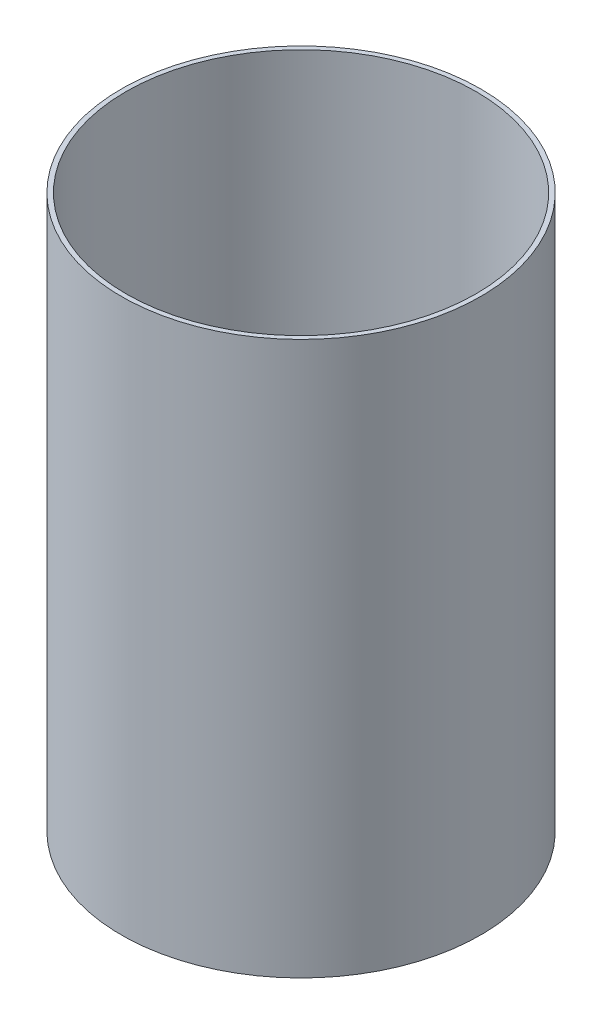
ISO-10303-21;
HEADER;
FILE_DESCRIPTION(('STEP AP214'),'2;1');
FILE_NAME('part.step','',(''),(''),'','','');
FILE_SCHEMA(('AUTOMOTIVE_DESIGN { 1 0 10303 214 1 1 1 1 }'));
ENDSEC;
DATA;
#1=APPLICATION_CONTEXT('core data for automotive mechanical design processes');
#2=APPLICATION_PROTOCOL_DEFINITION('international standard','automotive_design',2000,#1);
#3=PRODUCT_CONTEXT('',#1,'mechanical');
#4=PRODUCT('Part','Part','',(#3));
#5=PRODUCT_RELATED_PRODUCT_CATEGORY('part','',(#4));
#6=PRODUCT_DEFINITION_FORMATION('','',#4);
#7=PRODUCT_DEFINITION_CONTEXT('part definition',#1,'design');
#8=PRODUCT_DEFINITION('design','',#6,#7);
#9=PRODUCT_DEFINITION_SHAPE('','',#8);
#10=(LENGTH_UNIT() NAMED_UNIT(*) SI_UNIT(.MILLI.,.METRE.));
#11=(NAMED_UNIT(*) PLANE_ANGLE_UNIT() SI_UNIT($,.RADIAN.));
#12=(NAMED_UNIT(*) SI_UNIT($,.STERADIAN.) SOLID_ANGLE_UNIT());
#13=UNCERTAINTY_MEASURE_WITH_UNIT(LENGTH_MEASURE(1.E-05),#10,'distance_accuracy_value','');
#14=(GEOMETRIC_REPRESENTATION_CONTEXT(3) GLOBAL_UNCERTAINTY_ASSIGNED_CONTEXT((#13)) GLOBAL_UNIT_ASSIGNED_CONTEXT((#10,
#11,#12)) REPRESENTATION_CONTEXT('',''));
#15=CARTESIAN_POINT('',(0.,0.,0.));
#16=DIRECTION('',(0.,0.,1.));
#17=DIRECTION('',(1.,0.,0.));
#18=AXIS2_PLACEMENT_3D('',#15,#16,#17);
#19=CARTESIAN_POINT('',(0.,152.4,0.));
#20=DIRECTION('',(0.,1.,0.));
#21=DIRECTION('',(0.,0.,1.));
#22=AXIS2_PLACEMENT_3D('',#19,#20,#21);
#23=PLANE('',#22);
#24=CARTESIAN_POINT('',(0.,152.4,0.));
#25=DIRECTION('',(0.,1.,0.));
#26=DIRECTION('',(0.,0.,1.));
#27=AXIS2_PLACEMENT_3D('',#24,#25,#26);
#28=CIRCLE('',#27,49.53);
#29=CARTESIAN_POINT('',(0.,152.4,-49.53));
#30=VERTEX_POINT('',#29);
#31=EDGE_CURVE('E10',#30,#30,#28,.T.);
#32=ORIENTED_EDGE('',*,*,#31,.T.);
#33=EDGE_LOOP('',(#32));
#34=FACE_BOUND('',#33,.T.);
#35=CARTESIAN_POINT('',(0.,152.4,0.));
#36=DIRECTION('',(0.,1.,0.));
#37=DIRECTION('',(0.,0.,1.));
#38=AXIS2_PLACEMENT_3D('',#35,#36,#37);
#39=CIRCLE('',#38,48.26);
#40=CARTESIAN_POINT('',(0.,152.4,-48.26));
#41=VERTEX_POINT('',#40);
#42=EDGE_CURVE('E44',#41,#41,#39,.T.);
#43=ORIENTED_EDGE('',*,*,#42,.F.);
#44=EDGE_LOOP('',(#43));
#45=FACE_BOUND('',#44,.T.);
#46=ADVANCED_FACE('F33',(#34,#45),#23,.T.);
#47=CARTESIAN_POINT('',(0.,0.,0.));
#48=DIRECTION('',(0.,1.,0.));
#49=DIRECTION('',(0.,0.,1.));
#50=AXIS2_PLACEMENT_3D('',#47,#48,#49);
#51=PLANE('',#50);
#52=CARTESIAN_POINT('',(0.,0.,0.));
#53=DIRECTION('',(0.,1.,0.));
#54=DIRECTION('',(0.,0.,1.));
#55=AXIS2_PLACEMENT_3D('',#52,#53,#54);
#56=CIRCLE('',#55,49.53);
#57=CARTESIAN_POINT('',(0.,0.,-49.53));
#58=VERTEX_POINT('',#57);
#59=EDGE_CURVE('E37',#58,#58,#56,.T.);
#60=ORIENTED_EDGE('',*,*,#59,.F.);
#61=EDGE_LOOP('',(#60));
#62=FACE_BOUND('',#61,.T.);
#63=CARTESIAN_POINT('',(0.,0.,0.));
#64=DIRECTION('',(0.,1.,0.));
#65=DIRECTION('',(0.,0.,1.));
#66=AXIS2_PLACEMENT_3D('',#63,#64,#65);
#67=CIRCLE('',#66,48.26);
#68=CARTESIAN_POINT('',(0.,0.,-48.26));
#69=VERTEX_POINT('',#68);
#70=EDGE_CURVE('E46',#69,#69,#67,.T.);
#71=ORIENTED_EDGE('',*,*,#70,.T.);
#72=EDGE_LOOP('',(#71));
#73=FACE_BOUND('',#72,.T.);
#74=ADVANCED_FACE('F56',(#62,#73),#51,.F.);
#75=CARTESIAN_POINT('',(0.,152.4,0.));
#76=DIRECTION('',(0.,-1.,0.));
#77=DIRECTION('',(0.,0.,-1.));
#78=AXIS2_PLACEMENT_3D('',#75,#76,#77);
#79=CYLINDRICAL_SURFACE('',#78,49.53);
#80=CARTESIAN_POINT('',(0.,152.4,-49.53));
#81=CARTESIAN_POINT('',(0.,150.8125,-49.53));
#82=CARTESIAN_POINT('',(0.,149.225,-49.53));
#83=CARTESIAN_POINT('',(0.,146.05,-49.53));
#84=CARTESIAN_POINT('',(0.,144.4625,-49.53));
#85=CARTESIAN_POINT('',(0.,141.2875,-49.53));
#86=CARTESIAN_POINT('',(0.,139.7,-49.53));
#87=CARTESIAN_POINT('',(0.,136.525,-49.53));
#88=CARTESIAN_POINT('',(0.,134.9375,-49.53));
#89=CARTESIAN_POINT('',(0.,131.7625,-49.53));
#90=CARTESIAN_POINT('',(0.,130.175,-49.53));
#91=CARTESIAN_POINT('',(0.,127.,-49.53));
#92=CARTESIAN_POINT('',(0.,125.4125,-49.53));
#93=CARTESIAN_POINT('',(0.,122.2375,-49.53));
#94=CARTESIAN_POINT('',(0.,120.65,-49.53));
#95=CARTESIAN_POINT('',(0.,117.475,-49.53));
#96=CARTESIAN_POINT('',(0.,115.8875,-49.53));
#97=CARTESIAN_POINT('',(0.,112.7125,-49.53));
#98=CARTESIAN_POINT('',(0.,111.125,-49.53));
#99=CARTESIAN_POINT('',(0.,107.95,-49.53));
#100=CARTESIAN_POINT('',(0.,106.3625,-49.53));
#101=CARTESIAN_POINT('',(0.,103.1875,-49.53));
#102=CARTESIAN_POINT('',(0.,101.6,-49.53));
#103=CARTESIAN_POINT('',(0.,98.425,-49.53));
#104=CARTESIAN_POINT('',(0.,96.8375,-49.53));
#105=CARTESIAN_POINT('',(0.,93.6625,-49.53));
#106=CARTESIAN_POINT('',(0.,92.075,-49.53));
#107=CARTESIAN_POINT('',(0.,88.9,-49.53));
#108=CARTESIAN_POINT('',(0.,87.3125,-49.53));
#109=CARTESIAN_POINT('',(0.,84.1375,-49.53));
#110=CARTESIAN_POINT('',(0.,82.55,-49.53));
#111=CARTESIAN_POINT('',(0.,79.375,-49.53));
#112=CARTESIAN_POINT('',(0.,77.7875,-49.53));
#113=CARTESIAN_POINT('',(0.,74.6125,-49.53));
#114=CARTESIAN_POINT('',(0.,73.025,-49.53));
#115=CARTESIAN_POINT('',(0.,69.85,-49.53));
#116=CARTESIAN_POINT('',(0.,68.2625,-49.53));
#117=CARTESIAN_POINT('',(0.,65.0875,-49.53));
#118=CARTESIAN_POINT('',(0.,63.5,-49.53));
#119=CARTESIAN_POINT('',(0.,60.325,-49.53));
#120=CARTESIAN_POINT('',(0.,58.7375,-49.53));
#121=CARTESIAN_POINT('',(0.,55.5625,-49.53));
#122=CARTESIAN_POINT('',(0.,53.975,-49.53));
#123=CARTESIAN_POINT('',(0.,50.8,-49.53));
#124=CARTESIAN_POINT('',(0.,49.2125,-49.53));
#125=CARTESIAN_POINT('',(0.,46.0375,-49.53));
#126=CARTESIAN_POINT('',(0.,44.45,-49.53));
#127=CARTESIAN_POINT('',(0.,41.275,-49.53));
#128=CARTESIAN_POINT('',(0.,39.6875,-49.53));
#129=CARTESIAN_POINT('',(0.,36.5125,-49.53));
#130=CARTESIAN_POINT('',(0.,34.925,-49.53));
#131=CARTESIAN_POINT('',(0.,31.75,-49.53));
#132=CARTESIAN_POINT('',(0.,30.1625,-49.53));
#133=CARTESIAN_POINT('',(0.,26.9875,-49.53));
#134=CARTESIAN_POINT('',(0.,25.4,-49.53));
#135=CARTESIAN_POINT('',(0.,22.225,-49.53));
#136=CARTESIAN_POINT('',(0.,20.6375,-49.53));
#137=CARTESIAN_POINT('',(0.,17.4625,-49.53));
#138=CARTESIAN_POINT('',(0.,15.875,-49.53));
#139=CARTESIAN_POINT('',(0.,12.7,-49.53));
#140=CARTESIAN_POINT('',(0.,11.1125,-49.53));
#141=CARTESIAN_POINT('',(0.,7.93750000000001,-49.53));
#142=CARTESIAN_POINT('',(0.,6.35,-49.53));
#143=CARTESIAN_POINT('',(0.,3.175,-49.53));
#144=CARTESIAN_POINT('',(0.,1.5875,-49.53));
#145=CARTESIAN_POINT('',(0.,0.,-49.53));
#146=B_SPLINE_CURVE_WITH_KNOTS('',3,(#80,#81,#82,#83,#84,#85,#86,#87,#88,#89,#90,#91,#92,#93,
#94,#95,#96,#97,#98,#99,#100,#101,#102,#103,#104,#105,#106,#107,#108,#109,#110,#111,#112,#113,
#114,#115,#116,#117,#118,#119,#120,#121,#122,#123,#124,#125,#126,#127,#128,#129,#130,#131,#132,
#133,#134,#135,#136,#137,#138,#139,#140,#141,#142,#143,#144,#145),.UNSPECIFIED.,.F.,.F.,(4,2,2,
2,2,2,2,2,2,2,2,2,2,2,2,2,2,2,2,2,2,2,2,2,2,2,2,2,2,2,2,2,4),(0.,4.76249999999998,
9.52499999999998,14.2875,19.05,23.8125,28.575,33.3375,38.1,42.8625,47.625,52.3875,57.15,61.9125,
66.675,71.4375,76.2,80.9625,85.725,90.4875,95.25,100.0125,104.775,109.5375,114.3,119.0625,
123.825,128.5875,133.35,138.1125,142.875,147.6375,152.4),.UNSPECIFIED.);
#147=EDGE_CURVE('BSEAM35',#30,#58,#146,.T.);
#148=ORIENTED_EDGE('',*,*,#31,.F.);
#149=ORIENTED_EDGE('',*,*,#59,.T.);
#150=ORIENTED_EDGE('',*,*,#147,.T.);
#151=ORIENTED_EDGE('',*,*,#147,.F.);
#152=EDGE_LOOP('',(#148,#150,#149,#151));
#153=FACE_BOUND('',#152,.T.);
#154=ADVANCED_FACE('F35',(#153),#79,.T.);
#155=CARTESIAN_POINT('',(0.,152.4,0.));
#156=DIRECTION('',(0.,-1.,0.));
#157=DIRECTION('',(0.,0.,-1.));
#158=AXIS2_PLACEMENT_3D('',#155,#156,#157);
#159=CYLINDRICAL_SURFACE('',#158,48.26);
#160=CARTESIAN_POINT('',(0.,152.4,-48.26));
#161=CARTESIAN_POINT('',(0.,150.8125,-48.26));
#162=CARTESIAN_POINT('',(0.,149.225,-48.26));
#163=CARTESIAN_POINT('',(0.,146.05,-48.26));
#164=CARTESIAN_POINT('',(0.,144.4625,-48.26));
#165=CARTESIAN_POINT('',(0.,141.2875,-48.26));
#166=CARTESIAN_POINT('',(0.,139.7,-48.26));
#167=CARTESIAN_POINT('',(0.,136.525,-48.26));
#168=CARTESIAN_POINT('',(0.,134.9375,-48.26));
#169=CARTESIAN_POINT('',(0.,131.7625,-48.26));
#170=CARTESIAN_POINT('',(0.,130.175,-48.26));
#171=CARTESIAN_POINT('',(0.,127.,-48.26));
#172=CARTESIAN_POINT('',(0.,125.4125,-48.26));
#173=CARTESIAN_POINT('',(0.,122.2375,-48.26));
#174=CARTESIAN_POINT('',(0.,120.65,-48.26));
#175=CARTESIAN_POINT('',(0.,117.475,-48.26));
#176=CARTESIAN_POINT('',(0.,115.8875,-48.26));
#177=CARTESIAN_POINT('',(0.,112.7125,-48.26));
#178=CARTESIAN_POINT('',(0.,111.125,-48.26));
#179=CARTESIAN_POINT('',(0.,107.95,-48.26));
#180=CARTESIAN_POINT('',(0.,106.3625,-48.26));
#181=CARTESIAN_POINT('',(0.,103.1875,-48.26));
#182=CARTESIAN_POINT('',(0.,101.6,-48.26));
#183=CARTESIAN_POINT('',(0.,98.425,-48.26));
#184=CARTESIAN_POINT('',(0.,96.8375,-48.26));
#185=CARTESIAN_POINT('',(0.,93.6625,-48.26));
#186=CARTESIAN_POINT('',(0.,92.075,-48.26));
#187=CARTESIAN_POINT('',(0.,88.9,-48.26));
#188=CARTESIAN_POINT('',(0.,87.3125,-48.26));
#189=CARTESIAN_POINT('',(0.,84.1375,-48.26));
#190=CARTESIAN_POINT('',(0.,82.55,-48.26));
#191=CARTESIAN_POINT('',(0.,79.375,-48.26));
#192=CARTESIAN_POINT('',(0.,77.7875,-48.26));
#193=CARTESIAN_POINT('',(0.,74.6125,-48.26));
#194=CARTESIAN_POINT('',(0.,73.025,-48.26));
#195=CARTESIAN_POINT('',(0.,69.85,-48.26));
#196=CARTESIAN_POINT('',(0.,68.2625,-48.26));
#197=CARTESIAN_POINT('',(0.,65.0875,-48.26));
#198=CARTESIAN_POINT('',(0.,63.5,-48.26));
#199=CARTESIAN_POINT('',(0.,60.325,-48.26));
#200=CARTESIAN_POINT('',(0.,58.7375,-48.26));
#201=CARTESIAN_POINT('',(0.,55.5625,-48.26));
#202=CARTESIAN_POINT('',(0.,53.975,-48.26));
#203=CARTESIAN_POINT('',(0.,50.8,-48.26));
#204=CARTESIAN_POINT('',(0.,49.2125,-48.26));
#205=CARTESIAN_POINT('',(0.,46.0375,-48.26));
#206=CARTESIAN_POINT('',(0.,44.45,-48.26));
#207=CARTESIAN_POINT('',(0.,41.275,-48.26));
#208=CARTESIAN_POINT('',(0.,39.6875,-48.26));
#209=CARTESIAN_POINT('',(0.,36.5125,-48.26));
#210=CARTESIAN_POINT('',(0.,34.925,-48.26));
#211=CARTESIAN_POINT('',(0.,31.75,-48.26));
#212=CARTESIAN_POINT('',(0.,30.1625,-48.26));
#213=CARTESIAN_POINT('',(0.,26.9875,-48.26));
#214=CARTESIAN_POINT('',(0.,25.4,-48.26));
#215=CARTESIAN_POINT('',(0.,22.225,-48.26));
#216=CARTESIAN_POINT('',(0.,20.6375,-48.26));
#217=CARTESIAN_POINT('',(0.,17.4625,-48.26));
#218=CARTESIAN_POINT('',(0.,15.875,-48.26));
#219=CARTESIAN_POINT('',(0.,12.7,-48.26));
#220=CARTESIAN_POINT('',(0.,11.1125,-48.26));
#221=CARTESIAN_POINT('',(0.,7.93750000000001,-48.26));
#222=CARTESIAN_POINT('',(0.,6.35,-48.26));
#223=CARTESIAN_POINT('',(0.,3.175,-48.26));
#224=CARTESIAN_POINT('',(0.,1.5875,-48.26));
#225=CARTESIAN_POINT('',(0.,0.,-48.26));
#226=B_SPLINE_CURVE_WITH_KNOTS('',3,(#160,#161,#162,#163,#164,#165,#166,#167,#168,#169,#170,
#171,#172,#173,#174,#175,#176,#177,#178,#179,#180,#181,#182,#183,#184,#185,#186,#187,#188,#189,
#190,#191,#192,#193,#194,#195,#196,#197,#198,#199,#200,#201,#202,#203,#204,#205,#206,#207,#208,
#209,#210,#211,#212,#213,#214,#215,#216,#217,#218,#219,#220,#221,#222,#223,#224,#225),
.UNSPECIFIED.,.F.,.F.,(4,2,2,2,2,2,2,2,2,2,2,2,2,2,2,2,2,2,2,2,2,2,2,2,2,2,2,2,2,2,2,2,4),(0.,
4.7625,9.52500000000001,14.2875,19.05,23.8125,28.575,33.3375,38.1,42.8625,47.625,52.3875,57.15,
61.9125,66.675,71.4375,76.2,80.9625,85.725,90.4875,95.25,100.0125,104.775,109.5375,114.3,
119.0625,123.825,128.5875,133.35,138.1125,142.875,147.6375,152.4),.UNSPECIFIED.);
#227=EDGE_CURVE('BSEAM52',#41,#69,#226,.T.);
#228=ORIENTED_EDGE('',*,*,#42,.T.);
#229=ORIENTED_EDGE('',*,*,#70,.F.);
#230=ORIENTED_EDGE('',*,*,#227,.T.);
#231=ORIENTED_EDGE('',*,*,#227,.F.);
#232=EDGE_LOOP('',(#228,#230,#229,#231));
#233=FACE_BOUND('',#232,.T.);
#234=ADVANCED_FACE('F52',(#233),#159,.F.);
#235=CLOSED_SHELL('',(#46,#74,#154,#234));
#236=MANIFOLD_SOLID_BREP('B2',#235);
#237=ADVANCED_BREP_SHAPE_REPRESENTATION('',(#18,#236),#14);
#238=SHAPE_DEFINITION_REPRESENTATION(#9,#237);
ENDSEC;
END-ISO-10303-21;
